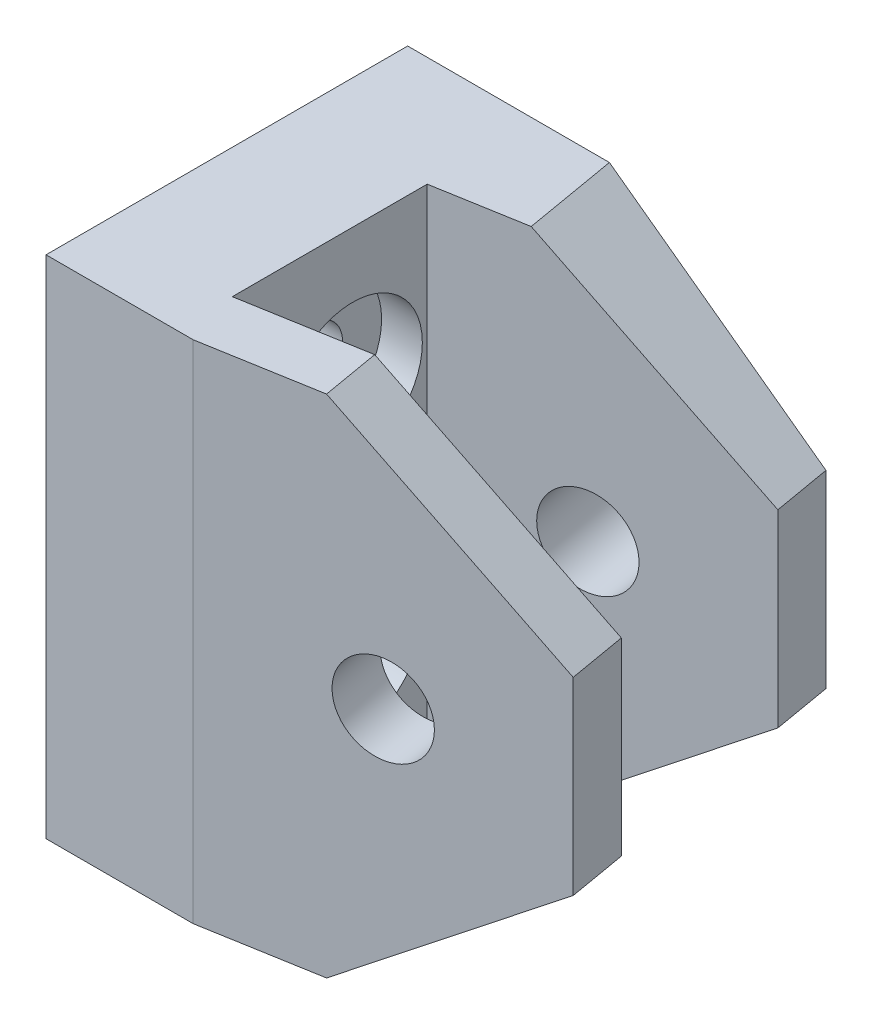
ISO-10303-21;
HEADER;
FILE_DESCRIPTION(('STEP AP214'),'2;1');
FILE_NAME('part.step','',(''),(''),'','','');
FILE_SCHEMA(('AUTOMOTIVE_DESIGN { 1 0 10303 214 1 1 1 1 }'));
ENDSEC;
DATA;
#1=APPLICATION_CONTEXT('core data for automotive mechanical design processes');
#2=APPLICATION_PROTOCOL_DEFINITION('international standard','automotive_design',2000,#1);
#3=PRODUCT_CONTEXT('',#1,'mechanical');
#4=PRODUCT('Part','Part','',(#3));
#5=PRODUCT_RELATED_PRODUCT_CATEGORY('part','',(#4));
#6=PRODUCT_DEFINITION_FORMATION('','',#4);
#7=PRODUCT_DEFINITION_CONTEXT('part definition',#1,'design');
#8=PRODUCT_DEFINITION('design','',#6,#7);
#9=PRODUCT_DEFINITION_SHAPE('','',#8);
#10=(LENGTH_UNIT() NAMED_UNIT(*) SI_UNIT(.MILLI.,.METRE.));
#11=(NAMED_UNIT(*) PLANE_ANGLE_UNIT() SI_UNIT($,.RADIAN.));
#12=(NAMED_UNIT(*) SI_UNIT($,.STERADIAN.) SOLID_ANGLE_UNIT());
#13=UNCERTAINTY_MEASURE_WITH_UNIT(LENGTH_MEASURE(1.E-05),#10,'distance_accuracy_value','');
#14=(GEOMETRIC_REPRESENTATION_CONTEXT(3) GLOBAL_UNCERTAINTY_ASSIGNED_CONTEXT((#13)) GLOBAL_UNIT_ASSIGNED_CONTEXT((#10,
#11,#12)) REPRESENTATION_CONTEXT('',''));
#15=CARTESIAN_POINT('',(0.,0.,0.));
#16=DIRECTION('',(0.,0.,1.));
#17=DIRECTION('',(1.,0.,0.));
#18=AXIS2_PLACEMENT_3D('',#15,#16,#17);
#19=CARTESIAN_POINT('',(60.611215954007,54.37886,35.6112177694173));
#20=DIRECTION('',(0.,0.,1.));
#21=DIRECTION('',(1.,0.,0.));
#22=AXIS2_PLACEMENT_3D('',#19,#20,#21);
#23=PLANE('',#22);
#24=CARTESIAN_POINT('',(42.6726162096916,27.18943,35.6112177694173));
#25=DIRECTION('',(0.,0.,1.));
#26=DIRECTION('',(1.,0.,0.));
#27=AXIS2_PLACEMENT_3D('',#24,#25,#26);
#28=ELLIPSE('',#27,4.83317143928453,4.76250000000001);
#29=CARTESIAN_POINT('',(47.5057876489762,27.18943,35.6112177694173));
#30=VERTEX_POINT('',#29);
#31=EDGE_CURVE('E227',#30,#30,#28,.T.);
#32=ORIENTED_EDGE('',*,*,#31,.T.);
#33=EDGE_LOOP('',(#32));
#34=FACE_BOUND('',#33,.T.);
#35=DIRECTION('',(-1.,0.,0.));
#36=VECTOR('',#35,1.);
#37=CARTESIAN_POINT('',(60.611215954007,54.37886,35.6112177694173));
#38=LINE('',#37,#36);
#39=CARTESIAN_POINT('',(37.3244908148905,54.37886,35.6112177694173));
#40=VERTEX_POINT('',#39);
#41=CARTESIAN_POINT('',(15.6308646789021,54.37886,35.6112177694173));
#42=VERTEX_POINT('',#41);
#43=EDGE_CURVE('E231',#40,#42,#38,.T.);
#44=ORIENTED_EDGE('',*,*,#43,.F.);
#45=DIRECTION('',(0.807189492984377,-0.590292404165617,0.));
#46=VECTOR('',#45,1.);
#47=CARTESIAN_POINT('',(52.4970701622485,43.2832518210183,35.6112177694173));
#48=LINE('',#47,#46);
#49=CARTESIAN_POINT('',(60.611215954007,37.34943,35.6112177694173));
#50=VERTEX_POINT('',#49);
#51=EDGE_CURVE('E58',#40,#50,#48,.T.);
#52=ORIENTED_EDGE('',*,*,#51,.T.);
#53=DIRECTION('',(0.,-1.,0.));
#54=VECTOR('',#53,1.);
#55=CARTESIAN_POINT('',(60.611215954007,54.37886,35.6112177694173));
#56=LINE('',#55,#54);
#57=CARTESIAN_POINT('',(60.611215954007,17.02943,35.6112177694173));
#58=VERTEX_POINT('',#57);
#59=EDGE_CURVE('E147',#50,#58,#56,.T.);
#60=ORIENTED_EDGE('',*,*,#59,.T.);
#61=DIRECTION('',(-0.807189492984377,-0.590292404165617,0.));
#62=VECTOR('',#61,1.);
#63=CARTESIAN_POINT('',(78.4073911788427,30.0436567085038,35.6112177694173));
#64=LINE('',#63,#62);
#65=CARTESIAN_POINT('',(37.3244908148905,0.,35.6112177694173));
#66=VERTEX_POINT('',#65);
#67=EDGE_CURVE('E129',#58,#66,#64,.T.);
#68=ORIENTED_EDGE('',*,*,#67,.T.);
#69=DIRECTION('',(-1.,0.,0.));
#70=VECTOR('',#69,1.);
#71=CARTESIAN_POINT('',(60.611215954007,0.,35.6112177694173));
#72=LINE('',#71,#70);
#73=CARTESIAN_POINT('',(15.6308646789021,0.,35.6112177694173));
#74=VERTEX_POINT('',#73);
#75=EDGE_CURVE('E230',#66,#74,#72,.T.);
#76=ORIENTED_EDGE('',*,*,#75,.T.);
#77=DIRECTION('',(0.,-1.,0.));
#78=VECTOR('',#77,1.);
#79=CARTESIAN_POINT('',(15.6308646789021,54.37886,35.6112177694173));
#80=LINE('',#79,#78);
#81=EDGE_CURVE('E182',#42,#74,#80,.T.);
#82=ORIENTED_EDGE('',*,*,#81,.F.);
#83=EDGE_LOOP('',(#44,#52,#60,#68,#76,#82));
#84=FACE_BOUND('',#83,.T.);
#85=ADVANCED_FACE('F35',(#34,#84),#23,.F.);
#86=CARTESIAN_POINT('',(15.6308646789021,54.37886,74.4972636547243));
#87=DIRECTION('',(1.,0.,0.));
#88=DIRECTION('',(0.,0.,-1.));
#89=AXIS2_PLACEMENT_3D('',#86,#87,#88);
#90=PLANE('',#89);
#91=CARTESIAN_POINT('',(15.6308646789021,14.48943,55.4472636547244));
#92=DIRECTION('',(1.,0.,0.));
#93=DIRECTION('',(0.,0.,-1.));
#94=AXIS2_PLACEMENT_3D('',#91,#92,#93);
#95=CIRCLE('',#94,3.3);
#96=CARTESIAN_POINT('',(15.6308646789021,14.48943,52.1472636547244));
#97=VERTEX_POINT('',#96);
#98=EDGE_CURVE('E38',#97,#97,#95,.T.);
#99=ORIENTED_EDGE('',*,*,#98,.T.);
#100=EDGE_LOOP('',(#99));
#101=FACE_BOUND('',#100,.T.);
#102=CARTESIAN_POINT('',(15.6308646789021,39.88943,55.4472636547244));
#103=DIRECTION('',(1.,0.,0.));
#104=DIRECTION('',(0.,0.,-1.));
#105=AXIS2_PLACEMENT_3D('',#102,#103,#104);
#106=CIRCLE('',#105,3.3);
#107=CARTESIAN_POINT('',(15.6308646789021,39.88943,52.1472636547244));
#108=VERTEX_POINT('',#107);
#109=EDGE_CURVE('E190',#108,#108,#106,.T.);
#110=ORIENTED_EDGE('',*,*,#109,.T.);
#111=EDGE_LOOP('',(#110));
#112=FACE_BOUND('',#111,.T.);
#113=DIRECTION('',(0.,0.,1.));
#114=VECTOR('',#113,1.);
#115=CARTESIAN_POINT('',(15.6308646789021,0.,74.4972636547243));
#116=LINE('',#115,#114);
#117=CARTESIAN_POINT('',(15.6308646789021,0.,74.4972636547243));
#118=VERTEX_POINT('',#117);
#119=EDGE_CURVE('E244',#74,#118,#116,.T.);
#120=ORIENTED_EDGE('',*,*,#119,.T.);
#121=DIRECTION('',(0.,-1.,0.));
#122=VECTOR('',#121,1.);
#123=CARTESIAN_POINT('',(15.6308646789021,54.37886,74.4972636547243));
#124=LINE('',#123,#122);
#125=CARTESIAN_POINT('',(15.6308646789021,54.37886,74.4972636547243));
#126=VERTEX_POINT('',#125);
#127=EDGE_CURVE('E179',#126,#118,#124,.T.);
#128=ORIENTED_EDGE('',*,*,#127,.F.);
#129=DIRECTION('',(0.,0.,1.));
#130=VECTOR('',#129,1.);
#131=CARTESIAN_POINT('',(15.6308646789021,54.37886,74.4972636547243));
#132=LINE('',#131,#130);
#133=EDGE_CURVE('E233',#42,#126,#132,.T.);
#134=ORIENTED_EDGE('',*,*,#133,.F.);
#135=ORIENTED_EDGE('',*,*,#81,.T.);
#136=EDGE_LOOP('',(#120,#128,#134,#135));
#137=FACE_BOUND('',#136,.T.);
#138=ADVANCED_FACE('F270',(#101,#112,#137),#90,.F.);
#139=CARTESIAN_POINT('',(31.4578731521571,54.37886,74.4972636547243));
#140=DIRECTION('',(0.,0.,-1.));
#141=DIRECTION('',(-1.,0.,0.));
#142=AXIS2_PLACEMENT_3D('',#139,#140,#141);
#143=PLANE('',#142);
#144=DIRECTION('',(1.,0.,0.));
#145=VECTOR('',#144,1.);
#146=CARTESIAN_POINT('',(31.4578731521571,0.,74.4972636547243));
#147=LINE('',#146,#145);
#148=CARTESIAN_POINT('',(31.4578731521571,0.,74.4972636547243));
#149=VERTEX_POINT('',#148);
#150=EDGE_CURVE('E246',#118,#149,#147,.T.);
#151=ORIENTED_EDGE('',*,*,#150,.T.);
#152=DIRECTION('',(0.,-1.,0.));
#153=VECTOR('',#152,1.);
#154=CARTESIAN_POINT('',(31.4578731521571,54.37886,74.4972636547243));
#155=LINE('',#154,#153);
#156=CARTESIAN_POINT('',(31.4578731521571,54.37886,74.4972636547243));
#157=VERTEX_POINT('',#156);
#158=EDGE_CURVE('E176',#157,#149,#155,.T.);
#159=ORIENTED_EDGE('',*,*,#158,.F.);
#160=DIRECTION('',(1.,0.,0.));
#161=VECTOR('',#160,1.);
#162=CARTESIAN_POINT('',(31.4578731521571,54.37886,74.4972636547243));
#163=LINE('',#162,#161);
#164=EDGE_CURVE('E235',#126,#157,#163,.T.);
#165=ORIENTED_EDGE('',*,*,#164,.F.);
#166=ORIENTED_EDGE('',*,*,#127,.T.);
#167=EDGE_LOOP('',(#151,#159,#165,#166));
#168=FACE_BOUND('',#167,.T.);
#169=ADVANCED_FACE('F295',(#168),#143,.F.);
#170=CARTESIAN_POINT('',(66.2935386692617,54.37886,68.4737655799524));
#171=DIRECTION('',(-0.170383467423126,0.,-0.985377833132485));
#172=DIRECTION('',(-0.985377833132486,0.,0.170383467423126));
#173=AXIS2_PLACEMENT_3D('',#170,#171,#172);
#174=PLANE('',#173);
#175=CARTESIAN_POINT('',(48.8757059107094,27.18943,71.4855146173384));
#176=DIRECTION('',(-0.170383467423126,0.,-0.985377833132485));
#177=DIRECTION('',(-0.985377833132486,0.,0.170383467423126));
#178=AXIS2_PLACEMENT_3D('',#175,#176,#177);
#179=CIRCLE('',#178,4.76250000000001);
#180=CARTESIAN_POINT('',(44.1828439804159,27.18943,72.296965880941));
#181=VERTEX_POINT('',#180);
#182=EDGE_CURVE('E224',#181,#181,#179,.T.);
#183=ORIENTED_EDGE('',*,*,#182,.T.);
#184=EDGE_LOOP('',(#183));
#185=FACE_BOUND('',#184,.T.);
#186=DIRECTION('',(0.,-1.,0.));
#187=VECTOR('',#186,1.);
#188=CARTESIAN_POINT('',(66.2935386692617,54.37886,68.4737655799524));
#189=LINE('',#188,#187);
#190=CARTESIAN_POINT('',(66.2935386692617,37.34943,68.4737655799524));
#191=VERTEX_POINT('',#190);
#192=CARTESIAN_POINT('',(66.2935386692617,17.02943,68.4737655799524));
#193=VERTEX_POINT('',#192);
#194=EDGE_CURVE('E173',#191,#193,#189,.T.);
#195=ORIENTED_EDGE('',*,*,#194,.F.);
#196=DIRECTION('',(-0.791275564660816,0.595955555555555,0.136820892312457));
#197=VECTOR('',#196,1.);
#198=CARTESIAN_POINT('',(58.2630543407943,43.3976538591601,69.8623311828761));
#199=LINE('',#198,#197);
#200=CARTESIAN_POINT('',(43.6828394090789,54.37886,72.3834225777808));
#201=VERTEX_POINT('',#200);
#202=EDGE_CURVE('E218',#191,#201,#199,.T.);
#203=ORIENTED_EDGE('',*,*,#202,.T.);
#204=DIRECTION('',(0.985377833132485,0.,-0.170383467423126));
#205=VECTOR('',#204,1.);
#206=CARTESIAN_POINT('',(66.2935386692617,54.37886,68.4737655799524));
#207=LINE('',#206,#205);
#208=EDGE_CURVE('E237',#157,#201,#207,.T.);
#209=ORIENTED_EDGE('',*,*,#208,.F.);
#210=ORIENTED_EDGE('',*,*,#158,.T.);
#211=DIRECTION('',(0.985377833132485,0.,-0.170383467423126));
#212=VECTOR('',#211,1.);
#213=CARTESIAN_POINT('',(66.2935386692617,0.,68.4737655799524));
#214=LINE('',#213,#212);
#215=CARTESIAN_POINT('',(43.6828394090789,0.,72.3834225777808));
#216=VERTEX_POINT('',#215);
#217=EDGE_CURVE('E248',#149,#216,#214,.T.);
#218=ORIENTED_EDGE('',*,*,#217,.T.);
#219=DIRECTION('',(0.791275564660816,0.595955555555555,-0.136820892312457));
#220=VECTOR('',#219,1.);
#221=CARTESIAN_POINT('',(83.9062251944237,30.294566510854,65.4283240245503));
#222=LINE('',#221,#220);
#223=EDGE_CURVE('E140',#216,#193,#222,.T.);
#224=ORIENTED_EDGE('',*,*,#223,.T.);
#225=EDGE_LOOP('',(#195,#203,#209,#210,#218,#224));
#226=FACE_BOUND('',#225,.T.);
#227=ADVANCED_FACE('F329',(#185,#226),#174,.F.);
#228=CARTESIAN_POINT('',(65.2116036511249,54.37886,62.2166163395611));
#229=DIRECTION('',(-0.985377833132485,0.,0.170383467423127));
#230=DIRECTION('',(0.170383467423127,0.,0.985377833132485));
#231=AXIS2_PLACEMENT_3D('',#228,#229,#230);
#232=PLANE('',#231);
#233=DIRECTION('',(0.,-1.,0.));
#234=VECTOR('',#233,1.);
#235=CARTESIAN_POINT('',(65.2116036511249,54.37886,62.2166163395611));
#236=LINE('',#235,#234);
#237=CARTESIAN_POINT('',(65.2116036511249,37.34943,62.2166163395611));
#238=VERTEX_POINT('',#237);
#239=CARTESIAN_POINT('',(65.2116036511249,17.02943,62.2166163395611));
#240=VERTEX_POINT('',#239);
#241=EDGE_CURVE('E170',#238,#240,#236,.T.);
#242=ORIENTED_EDGE('',*,*,#241,.F.);
#243=DIRECTION('',(0.170383467423126,0.,0.985377833132486));
#244=VECTOR('',#243,1.);
#245=CARTESIAN_POINT('',(59.3054126981246,37.34943,28.0593724980488));
#246=LINE('',#245,#244);
#247=EDGE_CURVE('E192',#238,#191,#246,.T.);
#248=ORIENTED_EDGE('',*,*,#247,.T.);
#249=ORIENTED_EDGE('',*,*,#194,.T.);
#250=DIRECTION('',(0.170383467423126,0.,0.985377833132486));
#251=VECTOR('',#250,1.);
#252=CARTESIAN_POINT('',(59.3054126981246,17.02943,28.0593724980488));
#253=LINE('',#252,#251);
#254=EDGE_CURVE('E151',#240,#193,#253,.T.);
#255=ORIENTED_EDGE('',*,*,#254,.F.);
#256=EDGE_LOOP('',(#242,#248,#249,#255));
#257=FACE_BOUND('',#256,.T.);
#258=ADVANCED_FACE('F325',(#257),#232,.F.);
#259=CARTESIAN_POINT('',(65.2116036511249,54.37886,62.2166163395611));
#260=DIRECTION('',(0.170383467423126,0.,0.985377833132486));
#261=DIRECTION('',(0.985377833132486,0.,-0.170383467423126));
#262=AXIS2_PLACEMENT_3D('',#259,#260,#261);
#263=PLANE('',#262);
#264=CARTESIAN_POINT('',(47.7937708925725,27.18943,65.2283653769471));
#265=DIRECTION('',(0.170383467423126,0.,0.985377833132486));
#266=DIRECTION('',(0.985377833132486,0.,-0.170383467423126));
#267=AXIS2_PLACEMENT_3D('',#264,#265,#266);
#268=CIRCLE('',#267,4.76250000000001);
#269=CARTESIAN_POINT('',(52.486632822866,27.18943,64.4169141133444));
#270=VERTEX_POINT('',#269);
#271=EDGE_CURVE('E189',#270,#270,#268,.T.);
#272=ORIENTED_EDGE('',*,*,#271,.T.);
#273=EDGE_LOOP('',(#272));
#274=FACE_BOUND('',#273,.T.);
#275=DIRECTION('',(-0.985377833132486,0.,0.170383467423126));
#276=VECTOR('',#275,1.);
#277=CARTESIAN_POINT('',(65.2116036511249,54.37886,62.2166163395611));
#278=LINE('',#277,#276);
#279=CARTESIAN_POINT('',(42.600904390942,54.37886,66.1262733373895));
#280=VERTEX_POINT('',#279);
#281=CARTESIAN_POINT('',(29.5458529808946,54.37886,68.3836459429411));
#282=VERTEX_POINT('',#281);
#283=EDGE_CURVE('E240',#280,#282,#278,.T.);
#284=ORIENTED_EDGE('',*,*,#283,.F.);
#285=DIRECTION('',(0.791275564660815,-0.595955555555555,-0.136820892312457));
#286=VECTOR('',#285,1.);
#287=CARTESIAN_POINT('',(57.1811193226575,43.3976538591601,63.6051819424849));
#288=LINE('',#287,#286);
#289=EDGE_CURVE('E51',#280,#238,#288,.T.);
#290=ORIENTED_EDGE('',*,*,#289,.T.);
#291=ORIENTED_EDGE('',*,*,#241,.T.);
#292=DIRECTION('',(-0.791275564660815,-0.595955555555555,0.136820892312457));
#293=VECTOR('',#292,1.);
#294=CARTESIAN_POINT('',(82.8242901762869,30.294566510854,59.171174784159));
#295=LINE('',#294,#293);
#296=CARTESIAN_POINT('',(42.600904390942,0.,66.1262733373895));
#297=VERTEX_POINT('',#296);
#298=EDGE_CURVE('E210',#240,#297,#295,.T.);
#299=ORIENTED_EDGE('',*,*,#298,.T.);
#300=DIRECTION('',(-0.985377833132486,0.,0.170383467423126));
#301=VECTOR('',#300,1.);
#302=CARTESIAN_POINT('',(65.2116036511249,0.,62.2166163395611));
#303=LINE('',#302,#301);
#304=CARTESIAN_POINT('',(29.5458529808946,0.,68.3836459429411));
#305=VERTEX_POINT('',#304);
#306=EDGE_CURVE('E251',#297,#305,#303,.T.);
#307=ORIENTED_EDGE('',*,*,#306,.T.);
#308=DIRECTION('',(0.,-1.,0.));
#309=VECTOR('',#308,1.);
#310=CARTESIAN_POINT('',(29.5458529808946,54.37886,68.3836459429411));
#311=LINE('',#310,#309);
#312=EDGE_CURVE('E167',#282,#305,#311,.T.);
#313=ORIENTED_EDGE('',*,*,#312,.F.);
#314=EDGE_LOOP('',(#284,#290,#291,#299,#307,#313));
#315=FACE_BOUND('',#314,.T.);
#316=ADVANCED_FACE('F321',(#274,#315),#263,.F.);
#317=CARTESIAN_POINT('',(29.5458529808946,54.37886,68.3836459429411));
#318=DIRECTION('',(-1.,0.,0.));
#319=DIRECTION('',(0.,0.,1.));
#320=AXIS2_PLACEMENT_3D('',#317,#318,#319);
#321=PLANE('',#320);
#322=CARTESIAN_POINT('',(29.5458529808946,14.48943,55.4472636547244));
#323=DIRECTION('',(1.,0.,0.));
#324=DIRECTION('',(0.,0.,-1.));
#325=AXIS2_PLACEMENT_3D('',#322,#323,#324);
#326=CIRCLE('',#325,7.5);
#327=CARTESIAN_POINT('',(29.5458529808946,14.48943,47.9472636547244));
#328=VERTEX_POINT('',#327);
#329=EDGE_CURVE('E482',#328,#328,#326,.T.);
#330=ORIENTED_EDGE('',*,*,#329,.F.);
#331=EDGE_LOOP('',(#330));
#332=FACE_BOUND('',#331,.T.);
#333=CARTESIAN_POINT('',(29.5458529808946,39.88943,55.4472636547244));
#334=DIRECTION('',(1.,0.,0.));
#335=DIRECTION('',(0.,0.,-1.));
#336=AXIS2_PLACEMENT_3D('',#333,#334,#335);
#337=CIRCLE('',#336,7.5);
#338=CARTESIAN_POINT('',(29.5458529808946,39.88943,47.9472636547244));
#339=VERTEX_POINT('',#338);
#340=EDGE_CURVE('E205',#339,#339,#337,.T.);
#341=ORIENTED_EDGE('',*,*,#340,.F.);
#342=EDGE_LOOP('',(#341));
#343=FACE_BOUND('',#342,.T.);
#344=DIRECTION('',(0.,0.,-1.));
#345=VECTOR('',#344,1.);
#346=CARTESIAN_POINT('',(29.5458529808946,0.,68.3836459429411));
#347=LINE('',#346,#345);
#348=CARTESIAN_POINT('',(29.5458529808946,0.,47.4270145822034));
#349=VERTEX_POINT('',#348);
#350=EDGE_CURVE('E252',#305,#349,#347,.T.);
#351=ORIENTED_EDGE('',*,*,#350,.T.);
#352=DIRECTION('',(0.,-1.,0.));
#353=VECTOR('',#352,1.);
#354=CARTESIAN_POINT('',(29.5458529808946,54.37886,47.4270145822034));
#355=LINE('',#354,#353);
#356=CARTESIAN_POINT('',(29.5458529808946,54.37886,47.4270145822034));
#357=VERTEX_POINT('',#356);
#358=EDGE_CURVE('E156',#357,#349,#355,.T.);
#359=ORIENTED_EDGE('',*,*,#358,.F.);
#360=DIRECTION('',(0.,0.,-1.));
#361=VECTOR('',#360,1.);
#362=CARTESIAN_POINT('',(29.5458529808946,54.37886,68.3836459429411));
#363=LINE('',#362,#361);
#364=EDGE_CURVE('E159',#282,#357,#363,.T.);
#365=ORIENTED_EDGE('',*,*,#364,.F.);
#366=ORIENTED_EDGE('',*,*,#312,.T.);
#367=EDGE_LOOP('',(#351,#359,#365,#366));
#368=FACE_BOUND('',#367,.T.);
#369=ADVANCED_FACE('F317',(#332,#343,#368),#321,.F.);
#370=CARTESIAN_POINT('',(29.5458529808946,54.37886,47.4270145822034));
#371=DIRECTION('',(-0.170383467423126,0.,-0.985377833132486));
#372=DIRECTION('',(-0.985377833132486,0.,0.170383467423126));
#373=AXIS2_PLACEMENT_3D('',#370,#371,#372);
#374=PLANE('',#373);
#375=CARTESIAN_POINT('',(44.2753182135915,27.18943,44.8801160471946));
#376=DIRECTION('',(-0.170383467423126,0.,-0.985377833132486));
#377=DIRECTION('',(-0.985377833132486,0.,0.170383467423126));
#378=AXIS2_PLACEMENT_3D('',#375,#376,#377);
#379=CIRCLE('',#378,4.76250000000001);
#380=CARTESIAN_POINT('',(39.582456283298,27.18943,45.6915673107973));
#381=VERTEX_POINT('',#380);
#382=EDGE_CURVE('E187',#381,#381,#379,.T.);
#383=ORIENTED_EDGE('',*,*,#382,.T.);
#384=EDGE_LOOP('',(#383));
#385=FACE_BOUND('',#384,.T.);
#386=DIRECTION('',(0.,-1.,0.));
#387=VECTOR('',#386,1.);
#388=CARTESIAN_POINT('',(61.6931509721438,54.37886,41.8683670098086));
#389=LINE('',#388,#387);
#390=CARTESIAN_POINT('',(61.6931509721438,37.34943,41.8683670098086));
#391=VERTEX_POINT('',#390);
#392=CARTESIAN_POINT('',(61.6931509721438,17.02943,41.8683670098086));
#393=VERTEX_POINT('',#392);
#394=EDGE_CURVE('E149',#391,#393,#389,.T.);
#395=ORIENTED_EDGE('',*,*,#394,.F.);
#396=DIRECTION('',(-0.791275564660815,0.595955555555555,0.136820892312457));
#397=VECTOR('',#396,1.);
#398=CARTESIAN_POINT('',(32.9329002267785,59.0104441603682,46.8413541028672));
#399=LINE('',#398,#397);
#400=CARTESIAN_POINT('',(39.082451711961,54.37886,45.7780240076371));
#401=VERTEX_POINT('',#400);
#402=EDGE_CURVE('E139',#391,#401,#399,.T.);
#403=ORIENTED_EDGE('',*,*,#402,.T.);
#404=DIRECTION('',(0.985377833132486,0.,-0.170383467423126));
#405=VECTOR('',#404,1.);
#406=CARTESIAN_POINT('',(29.5458529808946,54.37886,47.4270145822034));
#407=LINE('',#406,#405);
#408=EDGE_CURVE('E154',#357,#401,#407,.T.);
#409=ORIENTED_EDGE('',*,*,#408,.F.);
#410=ORIENTED_EDGE('',*,*,#358,.T.);
#411=DIRECTION('',(0.985377833132486,0.,-0.170383467423126));
#412=VECTOR('',#411,1.);
#413=CARTESIAN_POINT('',(29.5458529808946,0.,47.4270145822034));
#414=LINE('',#413,#412);
#415=CARTESIAN_POINT('',(39.082451711961,0.,45.7780240076371));
#416=VERTEX_POINT('',#415);
#417=EDGE_CURVE('E162',#349,#416,#414,.T.);
#418=ORIENTED_EDGE('',*,*,#417,.T.);
#419=DIRECTION('',(0.791275564660815,0.595955555555555,-0.136820892312457));
#420=VECTOR('',#419,1.);
#421=CARTESIAN_POINT('',(58.5760710804079,14.6817762096459,42.4073469445414));
#422=LINE('',#421,#420);
#423=EDGE_CURVE('E150',#416,#393,#422,.T.);
#424=ORIENTED_EDGE('',*,*,#423,.T.);
#425=EDGE_LOOP('',(#395,#403,#409,#410,#418,#424));
#426=FACE_BOUND('',#425,.T.);
#427=ADVANCED_FACE('F259',(#385,#426),#374,.F.);
#428=CARTESIAN_POINT('',(61.6931509721438,54.37886,41.8683670098086));
#429=DIRECTION('',(-0.985377833132485,0.,0.170383467423127));
#430=DIRECTION('',(0.170383467423127,0.,0.985377833132485));
#431=AXIS2_PLACEMENT_3D('',#428,#429,#430);
#432=PLANE('',#431);
#433=ORIENTED_EDGE('',*,*,#59,.F.);
#434=EDGE_CURVE('E197',#50,#391,#246,.T.);
#435=ORIENTED_EDGE('',*,*,#434,.T.);
#436=ORIENTED_EDGE('',*,*,#394,.T.);
#437=EDGE_CURVE('E132',#58,#393,#253,.T.);
#438=ORIENTED_EDGE('',*,*,#437,.F.);
#439=EDGE_LOOP('',(#433,#435,#436,#438));
#440=FACE_BOUND('',#439,.T.);
#441=ADVANCED_FACE('F145',(#440),#432,.F.);
#442=CARTESIAN_POINT('',(0.,54.37886,0.));
#443=DIRECTION('',(0.,-1.,0.));
#444=DIRECTION('',(0.,0.,-1.));
#445=AXIS2_PLACEMENT_3D('',#442,#443,#444);
#446=PLANE('',#445);
#447=ORIENTED_EDGE('',*,*,#208,.T.);
#448=DIRECTION('',(-0.170383467423126,0.,-0.985377833132485));
#449=VECTOR('',#448,1.);
#450=CARTESIAN_POINT('',(30.2620993674119,54.37886,-5.2326744608528));
#451=LINE('',#450,#449);
#452=EDGE_CURVE('E11',#201,#280,#451,.T.);
#453=ORIENTED_EDGE('',*,*,#452,.T.);
#454=ORIENTED_EDGE('',*,*,#283,.T.);
#455=ORIENTED_EDGE('',*,*,#364,.T.);
#456=ORIENTED_EDGE('',*,*,#408,.T.);
#457=EDGE_CURVE('E43',#401,#40,#451,.T.);
#458=ORIENTED_EDGE('',*,*,#457,.T.);
#459=ORIENTED_EDGE('',*,*,#43,.T.);
#460=ORIENTED_EDGE('',*,*,#133,.T.);
#461=ORIENTED_EDGE('',*,*,#164,.T.);
#462=EDGE_LOOP('',(#447,#453,#454,#455,#456,#458,#459,#460,#461));
#463=FACE_BOUND('',#462,.T.);
#464=ADVANCED_FACE('F274',(#463),#446,.F.);
#465=CARTESIAN_POINT('',(0.,0.,0.));
#466=DIRECTION('',(0.,-1.,0.));
#467=DIRECTION('',(0.,0.,-1.));
#468=AXIS2_PLACEMENT_3D('',#465,#466,#467);
#469=PLANE('',#468);
#470=DIRECTION('',(-0.170383467423126,0.,-0.985377833132485));
#471=VECTOR('',#470,1.);
#472=CARTESIAN_POINT('',(30.2620993674119,0.,-5.2326744608528));
#473=LINE('',#472,#471);
#474=EDGE_CURVE('E185',#216,#297,#473,.T.);
#475=ORIENTED_EDGE('',*,*,#474,.F.);
#476=ORIENTED_EDGE('',*,*,#217,.F.);
#477=ORIENTED_EDGE('',*,*,#150,.F.);
#478=ORIENTED_EDGE('',*,*,#119,.F.);
#479=ORIENTED_EDGE('',*,*,#75,.F.);
#480=EDGE_CURVE('E135',#416,#66,#473,.T.);
#481=ORIENTED_EDGE('',*,*,#480,.F.);
#482=ORIENTED_EDGE('',*,*,#417,.F.);
#483=ORIENTED_EDGE('',*,*,#350,.F.);
#484=ORIENTED_EDGE('',*,*,#306,.F.);
#485=EDGE_LOOP('',(#475,#476,#477,#478,#479,#481,#482,#483,#484));
#486=FACE_BOUND('',#485,.T.);
#487=ADVANCED_FACE('F263',(#486),#469,.T.);
#488=CARTESIAN_POINT('',(36.6947134379418,0.,31.9690294958772));
#489=DIRECTION('',(-0.5872413939766,0.803017419364281,0.101540973985631));
#490=DIRECTION('',(-0.807189492984377,-0.590292404165617,0.));
#491=AXIS2_PLACEMENT_3D('',#488,#489,#490);
#492=PLANE('',#491);
#493=ORIENTED_EDGE('',*,*,#437,.T.);
#494=ORIENTED_EDGE('',*,*,#423,.F.);
#495=ORIENTED_EDGE('',*,*,#480,.T.);
#496=ORIENTED_EDGE('',*,*,#67,.F.);
#497=EDGE_LOOP('',(#493,#494,#495,#496));
#498=FACE_BOUND('',#497,.T.);
#499=ADVANCED_FACE('F131',(#498),#492,.F.);
#500=ORIENTED_EDGE('',*,*,#474,.T.);
#501=ORIENTED_EDGE('',*,*,#298,.F.);
#502=ORIENTED_EDGE('',*,*,#254,.T.);
#503=ORIENTED_EDGE('',*,*,#223,.F.);
#504=EDGE_LOOP('',(#500,#501,#502,#503));
#505=FACE_BOUND('',#504,.T.);
#506=ADVANCED_FACE('F279',(#505),#492,.F.);
#507=CARTESIAN_POINT('',(59.3054126981246,37.34943,28.0593724980488));
#508=DIRECTION('',(-0.5872413939766,-0.803017419364281,0.101540973985631));
#509=DIRECTION('',(0.807189492984377,-0.590292404165617,0.));
#510=AXIS2_PLACEMENT_3D('',#507,#508,#509);
#511=PLANE('',#510);
#512=ORIENTED_EDGE('',*,*,#457,.F.);
#513=ORIENTED_EDGE('',*,*,#402,.F.);
#514=ORIENTED_EDGE('',*,*,#434,.F.);
#515=ORIENTED_EDGE('',*,*,#51,.F.);
#516=EDGE_LOOP('',(#512,#513,#514,#515));
#517=FACE_BOUND('',#516,.T.);
#518=ADVANCED_FACE('F276',(#517),#511,.F.);
#519=ORIENTED_EDGE('',*,*,#247,.F.);
#520=ORIENTED_EDGE('',*,*,#289,.F.);
#521=ORIENTED_EDGE('',*,*,#452,.F.);
#522=ORIENTED_EDGE('',*,*,#202,.F.);
#523=EDGE_LOOP('',(#519,#520,#521,#522));
#524=FACE_BOUND('',#523,.T.);
#525=ADVANCED_FACE('F278',(#524),#511,.F.);
#526=CARTESIAN_POINT('',(41.8875799395723,27.18943,31.0711215354348));
#527=DIRECTION('',(0.170383467423126,0.,0.985377833132486));
#528=DIRECTION('',(0.985377833132486,0.,-0.170383467423126));
#529=AXIS2_PLACEMENT_3D('',#526,#527,#528);
#530=CYLINDRICAL_SURFACE('',#529,4.76250000000001);
#531=ORIENTED_EDGE('',*,*,#382,.F.);
#532=EDGE_LOOP('',(#531));
#533=FACE_BOUND('',#532,.T.);
#534=ORIENTED_EDGE('',*,*,#31,.F.);
#535=EDGE_LOOP('',(#534));
#536=FACE_BOUND('',#535,.T.);
#537=ADVANCED_FACE('F285',(#533,#536),#530,.F.);
#538=ORIENTED_EDGE('',*,*,#271,.F.);
#539=EDGE_LOOP('',(#538));
#540=FACE_BOUND('',#539,.T.);
#541=ORIENTED_EDGE('',*,*,#182,.F.);
#542=EDGE_LOOP('',(#541));
#543=FACE_BOUND('',#542,.T.);
#544=ADVANCED_FACE('F300',(#540,#543),#530,.F.);
#545=CARTESIAN_POINT('',(29.5458529808946,39.88943,55.4472636547244));
#546=DIRECTION('',(1.,0.,0.));
#547=DIRECTION('',(0.,0.,-1.));
#548=AXIS2_PLACEMENT_3D('',#545,#546,#547);
#549=CYLINDRICAL_SURFACE('',#548,3.3);
#550=CARTESIAN_POINT('',(25.1658529808946,39.88943,55.4472636547244));
#551=DIRECTION('',(1.,0.,0.));
#552=DIRECTION('',(0.,0.,-1.));
#553=AXIS2_PLACEMENT_3D('',#550,#551,#552);
#554=CIRCLE('',#553,3.3);
#555=CARTESIAN_POINT('',(25.1658529808946,39.88943,52.1472636547244));
#556=VERTEX_POINT('',#555);
#557=EDGE_CURVE('E193',#556,#556,#554,.T.);
#558=ORIENTED_EDGE('',*,*,#557,.T.);
#559=EDGE_LOOP('',(#558));
#560=FACE_BOUND('',#559,.T.);
#561=ORIENTED_EDGE('',*,*,#109,.F.);
#562=EDGE_LOOP('',(#561));
#563=FACE_BOUND('',#562,.T.);
#564=ADVANCED_FACE('F305',(#560,#563),#549,.F.);
#565=CARTESIAN_POINT('',(25.1658529808946,43.18943,55.4472636547244));
#566=DIRECTION('',(-1.,0.,0.));
#567=DIRECTION('',(0.,0.,1.));
#568=AXIS2_PLACEMENT_3D('',#565,#566,#567);
#569=PLANE('',#568);
#570=ORIENTED_EDGE('',*,*,#557,.F.);
#571=EDGE_LOOP('',(#570));
#572=FACE_BOUND('',#571,.T.);
#573=CARTESIAN_POINT('',(25.1658529808946,39.88943,55.4472636547244));
#574=DIRECTION('',(1.,0.,0.));
#575=DIRECTION('',(0.,0.,-1.));
#576=AXIS2_PLACEMENT_3D('',#573,#574,#575);
#577=CIRCLE('',#576,7.5);
#578=CARTESIAN_POINT('',(25.1658529808946,39.88943,47.9472636547244));
#579=VERTEX_POINT('',#578);
#580=EDGE_CURVE('E200',#579,#579,#577,.T.);
#581=ORIENTED_EDGE('',*,*,#580,.T.);
#582=EDGE_LOOP('',(#581));
#583=FACE_BOUND('',#582,.T.);
#584=ADVANCED_FACE('F423',(#572,#583),#569,.F.);
#585=CARTESIAN_POINT('',(29.5458529808946,39.88943,55.4472636547244));
#586=DIRECTION('',(1.,0.,0.));
#587=DIRECTION('',(0.,0.,-1.));
#588=AXIS2_PLACEMENT_3D('',#585,#586,#587);
#589=CYLINDRICAL_SURFACE('',#588,7.5);
#590=ORIENTED_EDGE('',*,*,#580,.F.);
#591=EDGE_LOOP('',(#590));
#592=FACE_BOUND('',#591,.T.);
#593=ORIENTED_EDGE('',*,*,#340,.T.);
#594=EDGE_LOOP('',(#593));
#595=FACE_BOUND('',#594,.T.);
#596=ADVANCED_FACE('F429',(#592,#595),#589,.F.);
#597=CARTESIAN_POINT('',(29.5458529808946,14.48943,55.4472636547244));
#598=DIRECTION('',(1.,0.,0.));
#599=DIRECTION('',(0.,0.,-1.));
#600=AXIS2_PLACEMENT_3D('',#597,#598,#599);
#601=CYLINDRICAL_SURFACE('',#600,3.3);
#602=CARTESIAN_POINT('',(25.1658529808946,14.48943,55.4472636547244));
#603=DIRECTION('',(1.,0.,0.));
#604=DIRECTION('',(0.,0.,-1.));
#605=AXIS2_PLACEMENT_3D('',#602,#603,#604);
#606=CIRCLE('',#605,3.3);
#607=CARTESIAN_POINT('',(25.1658529808946,14.48943,52.1472636547244));
#608=VERTEX_POINT('',#607);
#609=EDGE_CURVE('E484',#608,#608,#606,.T.);
#610=ORIENTED_EDGE('',*,*,#609,.T.);
#611=EDGE_LOOP('',(#610));
#612=FACE_BOUND('',#611,.T.);
#613=ORIENTED_EDGE('',*,*,#98,.F.);
#614=EDGE_LOOP('',(#613));
#615=FACE_BOUND('',#614,.T.);
#616=ADVANCED_FACE('F437',(#612,#615),#601,.F.);
#617=CARTESIAN_POINT('',(25.1658529808946,17.78943,55.4472636547244));
#618=DIRECTION('',(-1.,0.,0.));
#619=DIRECTION('',(0.,0.,1.));
#620=AXIS2_PLACEMENT_3D('',#617,#618,#619);
#621=PLANE('',#620);
#622=ORIENTED_EDGE('',*,*,#609,.F.);
#623=EDGE_LOOP('',(#622));
#624=FACE_BOUND('',#623,.T.);
#625=CARTESIAN_POINT('',(25.1658529808946,14.48943,55.4472636547244));
#626=DIRECTION('',(1.,0.,0.));
#627=DIRECTION('',(0.,0.,-1.));
#628=AXIS2_PLACEMENT_3D('',#625,#626,#627);
#629=CIRCLE('',#628,7.5);
#630=CARTESIAN_POINT('',(25.1658529808946,14.48943,47.9472636547244));
#631=VERTEX_POINT('',#630);
#632=EDGE_CURVE('E479',#631,#631,#629,.T.);
#633=ORIENTED_EDGE('',*,*,#632,.T.);
#634=EDGE_LOOP('',(#633));
#635=FACE_BOUND('',#634,.T.);
#636=ADVANCED_FACE('F445',(#624,#635),#621,.F.);
#637=CARTESIAN_POINT('',(29.5458529808946,14.48943,55.4472636547244));
#638=DIRECTION('',(1.,0.,0.));
#639=DIRECTION('',(0.,0.,-1.));
#640=AXIS2_PLACEMENT_3D('',#637,#638,#639);
#641=CYLINDRICAL_SURFACE('',#640,7.5);
#642=ORIENTED_EDGE('',*,*,#632,.F.);
#643=EDGE_LOOP('',(#642));
#644=FACE_BOUND('',#643,.T.);
#645=ORIENTED_EDGE('',*,*,#329,.T.);
#646=EDGE_LOOP('',(#645));
#647=FACE_BOUND('',#646,.T.);
#648=ADVANCED_FACE('F453',(#644,#647),#641,.F.);
#649=CLOSED_SHELL('',(#85,#138,#169,#227,#258,#316,#369,#427,#441,#464,#487,#499,#506,#518,#525,
#537,#544,#564,#584,#596,#616,#636,#648));
#650=MANIFOLD_SOLID_BREP('B2',#649);
#651=ADVANCED_BREP_SHAPE_REPRESENTATION('',(#18,#650),#14);
#652=SHAPE_DEFINITION_REPRESENTATION(#9,#651);
ENDSEC;
END-ISO-10303-21;
